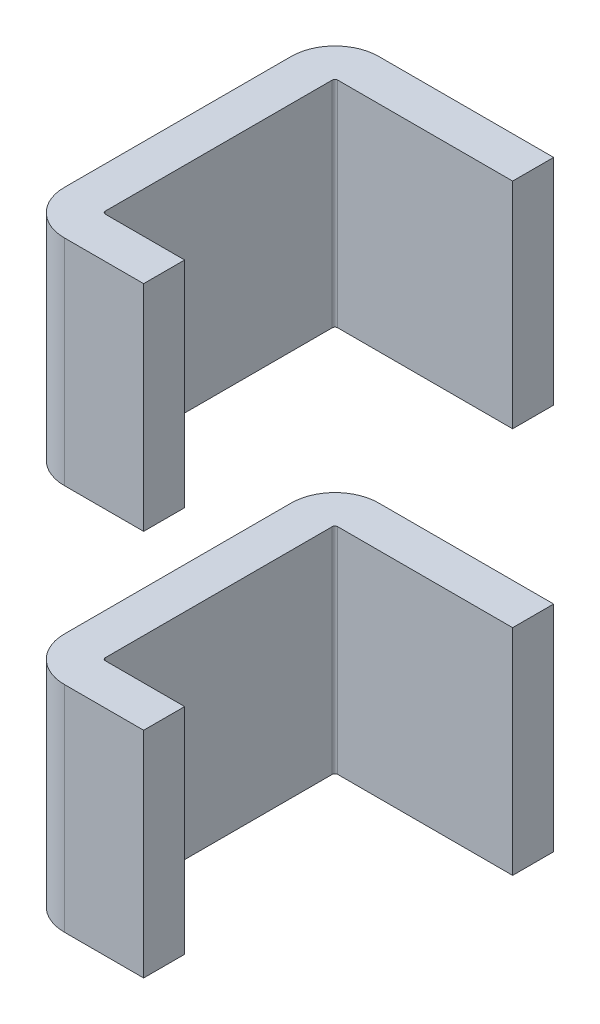
ISO-10303-21;
HEADER;
FILE_DESCRIPTION(('STEP AP214'),'2;1');
FILE_NAME('part.step','',(''),(''),'','','');
FILE_SCHEMA(('AUTOMOTIVE_DESIGN { 1 0 10303 214 1 1 1 1 }'));
ENDSEC;
DATA;
#1=APPLICATION_CONTEXT('core data for automotive mechanical design processes');
#2=APPLICATION_PROTOCOL_DEFINITION('international standard','automotive_design',2000,#1);
#3=PRODUCT_CONTEXT('',#1,'mechanical');
#4=PRODUCT('Part','Part','',(#3));
#5=PRODUCT_RELATED_PRODUCT_CATEGORY('part','',(#4));
#6=PRODUCT_DEFINITION_FORMATION('','',#4);
#7=PRODUCT_DEFINITION_CONTEXT('part definition',#1,'design');
#8=PRODUCT_DEFINITION('design','',#6,#7);
#9=PRODUCT_DEFINITION_SHAPE('','',#8);
#10=(LENGTH_UNIT() NAMED_UNIT(*) SI_UNIT(.MILLI.,.METRE.));
#11=(NAMED_UNIT(*) PLANE_ANGLE_UNIT() SI_UNIT($,.RADIAN.));
#12=(NAMED_UNIT(*) SI_UNIT($,.STERADIAN.) SOLID_ANGLE_UNIT());
#13=UNCERTAINTY_MEASURE_WITH_UNIT(LENGTH_MEASURE(1.E-05),#10,'distance_accuracy_value','');
#14=(GEOMETRIC_REPRESENTATION_CONTEXT(3) GLOBAL_UNCERTAINTY_ASSIGNED_CONTEXT((#13)) GLOBAL_UNIT_ASSIGNED_CONTEXT((#10,
#11,#12)) REPRESENTATION_CONTEXT('',''));
#15=CARTESIAN_POINT('',(0.,0.,0.));
#16=DIRECTION('',(0.,0.,1.));
#17=DIRECTION('',(1.,0.,0.));
#18=AXIS2_PLACEMENT_3D('',#15,#16,#17);
#19=CARTESIAN_POINT('',(-0.95,-1.1,-0.135));
#20=DIRECTION('',(0.,0.,-1.));
#21=DIRECTION('',(0.,1.,0.));
#22=AXIS2_PLACEMENT_3D('',#19,#20,#21);
#23=PLANE('',#22);
#24=DIRECTION('',(1.,0.,0.));
#25=VECTOR('',#24,1.);
#26=CARTESIAN_POINT('',(-0.95,1.1,-0.135));
#27=LINE('',#26,#25);
#28=CARTESIAN_POINT('',(-0.95,1.1,-0.135));
#29=VERTEX_POINT('',#28);
#30=CARTESIAN_POINT('',(-1.59,1.1,-0.135));
#31=VERTEX_POINT('',#30);
#32=EDGE_CURVE('P0_E181',#29,#31,#27,.F.);
#33=ORIENTED_EDGE('',*,*,#32,.F.);
#34=DIRECTION('',(0.,1.,0.));
#35=VECTOR('',#34,1.);
#36=CARTESIAN_POINT('',(-0.95,0.,-0.135));
#37=LINE('',#36,#35);
#38=CARTESIAN_POINT('',(-0.95,0.315,-0.135));
#39=VERTEX_POINT('',#38);
#40=EDGE_CURVE('P0_E124',#39,#29,#37,.T.);
#41=ORIENTED_EDGE('',*,*,#40,.F.);
#42=DIRECTION('',(1.,0.,0.));
#43=VECTOR('',#42,1.);
#44=CARTESIAN_POINT('',(-0.95,0.315,-0.135));
#45=LINE('',#44,#43);
#46=CARTESIAN_POINT('',(-1.59,0.315,-0.135));
#47=VERTEX_POINT('',#46);
#48=EDGE_CURVE('P0_E130',#39,#47,#45,.F.);
#49=ORIENTED_EDGE('',*,*,#48,.T.);
#50=DIRECTION('',(0.,1.,0.));
#51=VECTOR('',#50,1.);
#52=CARTESIAN_POINT('',(-1.59,0.,-0.135));
#53=LINE('',#52,#51);
#54=EDGE_CURVE('P0_E81',#31,#47,#53,.F.);
#55=ORIENTED_EDGE('',*,*,#54,.F.);
#56=EDGE_LOOP('',(#33,#41,#49,#55));
#57=FACE_BOUND('',#56,.T.);
#58=ADVANCED_FACE('P0_F17',(#57),#23,.T.);
#59=CARTESIAN_POINT('',(-1.59,0.,0.025));
#60=DIRECTION('',(0.,1.,0.));
#61=DIRECTION('',(0.,0.,1.));
#62=AXIS2_PLACEMENT_3D('',#59,#60,#61);
#63=CYLINDRICAL_SURFACE('',#62,0.16);
#64=CARTESIAN_POINT('',(-1.59,1.1,0.025));
#65=DIRECTION('',(0.,1.,0.));
#66=DIRECTION('',(0.,0.,1.));
#67=AXIS2_PLACEMENT_3D('',#64,#65,#66);
#68=CIRCLE('',#67,0.16);
#69=CARTESIAN_POINT('',(-1.75,1.1,0.025));
#70=VERTEX_POINT('',#69);
#71=EDGE_CURVE('P0_E179',#31,#70,#68,.T.);
#72=ORIENTED_EDGE('',*,*,#71,.F.);
#73=ORIENTED_EDGE('',*,*,#54,.T.);
#74=CARTESIAN_POINT('',(-1.59,0.315,0.025));
#75=DIRECTION('',(0.,1.,0.));
#76=DIRECTION('',(0.,0.,1.));
#77=AXIS2_PLACEMENT_3D('',#74,#75,#76);
#78=CIRCLE('',#77,0.16);
#79=CARTESIAN_POINT('',(-1.75,0.315,0.025));
#80=VERTEX_POINT('',#79);
#81=EDGE_CURVE('P0_E20',#47,#80,#78,.T.);
#82=ORIENTED_EDGE('',*,*,#81,.T.);
#83=DIRECTION('',(0.,-1.,0.));
#84=VECTOR('',#83,1.);
#85=CARTESIAN_POINT('',(-1.75,-1.1,0.025));
#86=LINE('',#85,#84);
#87=EDGE_CURVE('P0_E86',#70,#80,#86,.T.);
#88=ORIENTED_EDGE('',*,*,#87,.F.);
#89=EDGE_LOOP('',(#72,#73,#82,#88));
#90=FACE_BOUND('',#89,.T.);
#91=ADVANCED_FACE('P0_F85',(#90),#63,.T.);
#92=CARTESIAN_POINT('',(-1.75,-1.1,0.025));
#93=DIRECTION('',(-1.,0.,0.));
#94=DIRECTION('',(0.,-1.,0.));
#95=AXIS2_PLACEMENT_3D('',#92,#93,#94);
#96=PLANE('',#95);
#97=DIRECTION('',(0.,0.,1.));
#98=VECTOR('',#97,1.);
#99=CARTESIAN_POINT('',(-1.75,1.1,-0.135));
#100=LINE('',#99,#98);
#101=CARTESIAN_POINT('',(-1.75,1.1,0.855));
#102=VERTEX_POINT('',#101);
#103=EDGE_CURVE('P0_E97',#70,#102,#100,.T.);
#104=ORIENTED_EDGE('',*,*,#103,.F.);
#105=ORIENTED_EDGE('',*,*,#87,.T.);
#106=DIRECTION('',(0.,0.,1.));
#107=VECTOR('',#106,1.);
#108=CARTESIAN_POINT('',(-1.75,0.315,-1.593456681686));
#109=LINE('',#108,#107);
#110=CARTESIAN_POINT('',(-1.75,0.315,0.855));
#111=VERTEX_POINT('',#110);
#112=EDGE_CURVE('P0_E91',#80,#111,#109,.T.);
#113=ORIENTED_EDGE('',*,*,#112,.T.);
#114=DIRECTION('',(0.,1.,0.));
#115=VECTOR('',#114,1.);
#116=CARTESIAN_POINT('',(-1.75,0.,0.855));
#117=LINE('',#116,#115);
#118=EDGE_CURVE('P0_E99',#102,#111,#117,.F.);
#119=ORIENTED_EDGE('',*,*,#118,.F.);
#120=EDGE_LOOP('',(#104,#105,#113,#119));
#121=FACE_BOUND('',#120,.T.);
#122=ADVANCED_FACE('P0_F94',(#121),#96,.T.);
#123=CARTESIAN_POINT('',(-1.59,0.,0.855));
#124=DIRECTION('',(0.,1.,0.));
#125=DIRECTION('',(0.,0.,1.));
#126=AXIS2_PLACEMENT_3D('',#123,#124,#125);
#127=CYLINDRICAL_SURFACE('',#126,0.16);
#128=CARTESIAN_POINT('',(-1.59,1.1,0.855));
#129=DIRECTION('',(0.,1.,0.));
#130=DIRECTION('',(0.,0.,1.));
#131=AXIS2_PLACEMENT_3D('',#128,#129,#130);
#132=CIRCLE('',#131,0.16);
#133=CARTESIAN_POINT('',(-1.59,1.1,1.015));
#134=VERTEX_POINT('',#133);
#135=EDGE_CURVE('P0_E176',#102,#134,#132,.T.);
#136=ORIENTED_EDGE('',*,*,#135,.F.);
#137=ORIENTED_EDGE('',*,*,#118,.T.);
#138=CARTESIAN_POINT('',(-1.59,0.315,0.855));
#139=DIRECTION('',(0.,1.,0.));
#140=DIRECTION('',(0.,0.,1.));
#141=AXIS2_PLACEMENT_3D('',#138,#139,#140);
#142=CIRCLE('',#141,0.16);
#143=CARTESIAN_POINT('',(-1.59,0.315,1.015));
#144=VERTEX_POINT('',#143);
#145=EDGE_CURVE('P0_E105',#111,#144,#142,.T.);
#146=ORIENTED_EDGE('',*,*,#145,.T.);
#147=DIRECTION('',(0.,-1.,0.));
#148=VECTOR('',#147,1.);
#149=CARTESIAN_POINT('',(-1.59,-1.1,1.015));
#150=LINE('',#149,#148);
#151=EDGE_CURVE('P0_E145',#134,#144,#150,.T.);
#152=ORIENTED_EDGE('',*,*,#151,.F.);
#153=EDGE_LOOP('',(#136,#137,#146,#152));
#154=FACE_BOUND('',#153,.T.);
#155=ADVANCED_FACE('P0_F290',(#154),#127,.T.);
#156=CARTESIAN_POINT('',(-1.59,-1.1,1.015));
#157=DIRECTION('',(0.,0.,1.));
#158=DIRECTION('',(0.,-1.,0.));
#159=AXIS2_PLACEMENT_3D('',#156,#157,#158);
#160=PLANE('',#159);
#161=DIRECTION('',(1.,0.,0.));
#162=VECTOR('',#161,1.);
#163=CARTESIAN_POINT('',(-0.95,1.1,1.015));
#164=LINE('',#163,#162);
#165=CARTESIAN_POINT('',(-1.3,1.1,1.015));
#166=VERTEX_POINT('',#165);
#167=EDGE_CURVE('P0_E139',#134,#166,#164,.T.);
#168=ORIENTED_EDGE('',*,*,#167,.F.);
#169=ORIENTED_EDGE('',*,*,#151,.T.);
#170=DIRECTION('',(1.,0.,0.));
#171=VECTOR('',#170,1.);
#172=CARTESIAN_POINT('',(-0.95,0.315000000000001,1.015));
#173=LINE('',#172,#171);
#174=CARTESIAN_POINT('',(-1.3,0.315,1.015));
#175=VERTEX_POINT('',#174);
#176=EDGE_CURVE('P0_E107',#144,#175,#173,.T.);
#177=ORIENTED_EDGE('',*,*,#176,.T.);
#178=DIRECTION('',(0.,1.,0.));
#179=VECTOR('',#178,1.);
#180=CARTESIAN_POINT('',(-1.3,0.,1.015));
#181=LINE('',#180,#179);
#182=EDGE_CURVE('P0_E142',#175,#166,#181,.T.);
#183=ORIENTED_EDGE('',*,*,#182,.T.);
#184=EDGE_LOOP('',(#168,#169,#177,#183));
#185=FACE_BOUND('',#184,.T.);
#186=ADVANCED_FACE('P0_F215',(#185),#160,.T.);
#187=CARTESIAN_POINT('',(-1.3,0.,0.94));
#188=DIRECTION('',(-1.,0.,0.));
#189=DIRECTION('',(0.,0.,1.));
#190=AXIS2_PLACEMENT_3D('',#187,#188,#189);
#191=PLANE('',#190);
#192=DIRECTION('',(0.,0.,1.));
#193=VECTOR('',#192,1.);
#194=CARTESIAN_POINT('',(-1.3,0.315,-1.593456681686));
#195=LINE('',#194,#193);
#196=CARTESIAN_POINT('',(-1.3,0.315,0.865));
#197=VERTEX_POINT('',#196);
#198=EDGE_CURVE('P0_E162',#175,#197,#195,.F.);
#199=ORIENTED_EDGE('',*,*,#198,.T.);
#200=DIRECTION('',(0.,1.,0.));
#201=VECTOR('',#200,1.);
#202=CARTESIAN_POINT('',(-1.3,1.1,0.865));
#203=LINE('',#202,#201);
#204=CARTESIAN_POINT('',(-1.3,1.1,0.865));
#205=VERTEX_POINT('',#204);
#206=EDGE_CURVE('P0_E92',#205,#197,#203,.F.);
#207=ORIENTED_EDGE('',*,*,#206,.F.);
#208=DIRECTION('',(0.,0.,1.));
#209=VECTOR('',#208,1.);
#210=CARTESIAN_POINT('',(-1.3,1.1,-0.135));
#211=LINE('',#210,#209);
#212=EDGE_CURVE('P0_E135',#166,#205,#211,.F.);
#213=ORIENTED_EDGE('',*,*,#212,.F.);
#214=ORIENTED_EDGE('',*,*,#182,.F.);
#215=EDGE_LOOP('',(#199,#207,#213,#214));
#216=FACE_BOUND('',#215,.T.);
#217=ADVANCED_FACE('P0_F221',(#216),#191,.F.);
#218=CARTESIAN_POINT('',(-0.95,1.1,0.015));
#219=DIRECTION('',(0.,0.,1.));
#220=DIRECTION('',(0.,-1.,0.));
#221=AXIS2_PLACEMENT_3D('',#218,#219,#220);
#222=PLANE('',#221);
#223=DIRECTION('',(1.,0.,0.));
#224=VECTOR('',#223,1.);
#225=CARTESIAN_POINT('',(-0.95,1.1,0.015));
#226=LINE('',#225,#224);
#227=CARTESIAN_POINT('',(-1.59,1.1,0.015));
#228=VERTEX_POINT('',#227);
#229=CARTESIAN_POINT('',(-0.95,1.1,0.015));
#230=VERTEX_POINT('',#229);
#231=EDGE_CURVE('P0_E118',#228,#230,#226,.T.);
#232=ORIENTED_EDGE('',*,*,#231,.F.);
#233=DIRECTION('',(0.,1.,0.));
#234=VECTOR('',#233,1.);
#235=CARTESIAN_POINT('',(-1.59,0.,0.015));
#236=LINE('',#235,#234);
#237=CARTESIAN_POINT('',(-1.59,0.315,0.015));
#238=VERTEX_POINT('',#237);
#239=EDGE_CURVE('P0_E127',#228,#238,#236,.F.);
#240=ORIENTED_EDGE('',*,*,#239,.T.);
#241=DIRECTION('',(1.,0.,0.));
#242=VECTOR('',#241,1.);
#243=CARTESIAN_POINT('',(-0.95,0.315,0.015));
#244=LINE('',#243,#242);
#245=CARTESIAN_POINT('',(-0.95,0.315,0.015));
#246=VERTEX_POINT('',#245);
#247=EDGE_CURVE('P0_E159',#238,#246,#244,.T.);
#248=ORIENTED_EDGE('',*,*,#247,.T.);
#249=DIRECTION('',(0.,1.,0.));
#250=VECTOR('',#249,1.);
#251=CARTESIAN_POINT('',(-0.95,0.,0.015));
#252=LINE('',#251,#250);
#253=EDGE_CURVE('P0_E121',#230,#246,#252,.F.);
#254=ORIENTED_EDGE('',*,*,#253,.F.);
#255=EDGE_LOOP('',(#232,#240,#248,#254));
#256=FACE_BOUND('',#255,.T.);
#257=ADVANCED_FACE('P0_F256',(#256),#222,.T.);
#258=CARTESIAN_POINT('',(-0.95,0.,-0.06));
#259=DIRECTION('',(1.,0.,0.));
#260=DIRECTION('',(0.,0.,-1.));
#261=AXIS2_PLACEMENT_3D('',#258,#259,#260);
#262=PLANE('',#261);
#263=DIRECTION('',(0.,0.,1.));
#264=VECTOR('',#263,1.);
#265=CARTESIAN_POINT('',(-0.95,1.1,-0.135));
#266=LINE('',#265,#264);
#267=EDGE_CURVE('P0_E115',#230,#29,#266,.F.);
#268=ORIENTED_EDGE('',*,*,#267,.F.);
#269=ORIENTED_EDGE('',*,*,#253,.T.);
#270=DIRECTION('',(0.,0.,1.));
#271=VECTOR('',#270,1.);
#272=CARTESIAN_POINT('',(-0.95,0.315,-1.593456681686));
#273=LINE('',#272,#271);
#274=EDGE_CURVE('P0_E156',#246,#39,#273,.F.);
#275=ORIENTED_EDGE('',*,*,#274,.T.);
#276=ORIENTED_EDGE('',*,*,#40,.T.);
#277=EDGE_LOOP('',(#268,#269,#275,#276));
#278=FACE_BOUND('',#277,.T.);
#279=ADVANCED_FACE('P0_F258',(#278),#262,.T.);
#280=CARTESIAN_POINT('',(-1.59,1.1,0.865));
#281=DIRECTION('',(0.,0.,-1.));
#282=DIRECTION('',(0.,1.,0.));
#283=AXIS2_PLACEMENT_3D('',#280,#281,#282);
#284=PLANE('',#283);
#285=DIRECTION('',(1.,0.,0.));
#286=VECTOR('',#285,1.);
#287=CARTESIAN_POINT('',(-0.95,1.1,0.865));
#288=LINE('',#287,#286);
#289=CARTESIAN_POINT('',(-1.59,1.1,0.865));
#290=VERTEX_POINT('',#289);
#291=EDGE_CURVE('P0_E138',#205,#290,#288,.F.);
#292=ORIENTED_EDGE('',*,*,#291,.F.);
#293=ORIENTED_EDGE('',*,*,#206,.T.);
#294=DIRECTION('',(1.,0.,0.));
#295=VECTOR('',#294,1.);
#296=CARTESIAN_POINT('',(-0.95,0.315000000000001,0.865));
#297=LINE('',#296,#295);
#298=CARTESIAN_POINT('',(-1.59,0.315,0.865));
#299=VERTEX_POINT('',#298);
#300=EDGE_CURVE('P0_E165',#197,#299,#297,.F.);
#301=ORIENTED_EDGE('',*,*,#300,.T.);
#302=DIRECTION('',(0.,1.,0.));
#303=VECTOR('',#302,1.);
#304=CARTESIAN_POINT('',(-1.59,0.,0.865));
#305=LINE('',#304,#303);
#306=EDGE_CURVE('P0_E112',#299,#290,#305,.T.);
#307=ORIENTED_EDGE('',*,*,#306,.T.);
#308=EDGE_LOOP('',(#292,#293,#301,#307));
#309=FACE_BOUND('',#308,.T.);
#310=ADVANCED_FACE('P0_F232',(#309),#284,.T.);
#311=CARTESIAN_POINT('',(-0.95,0.315,-1.593456681686));
#312=DIRECTION('',(0.,1.,0.));
#313=DIRECTION('',(0.,0.,1.));
#314=AXIS2_PLACEMENT_3D('',#311,#312,#313);
#315=PLANE('',#314);
#316=ORIENTED_EDGE('',*,*,#274,.F.);
#317=ORIENTED_EDGE('',*,*,#247,.F.);
#318=CARTESIAN_POINT('',(-1.59,0.315,0.025));
#319=DIRECTION('',(0.,1.,0.));
#320=DIRECTION('',(0.,0.,1.));
#321=AXIS2_PLACEMENT_3D('',#318,#319,#320);
#322=CIRCLE('',#321,0.01);
#323=CARTESIAN_POINT('',(-1.6,0.315,0.025));
#324=VERTEX_POINT('',#323);
#325=EDGE_CURVE('P0_E129',#238,#324,#322,.T.);
#326=ORIENTED_EDGE('',*,*,#325,.T.);
#327=DIRECTION('',(0.,0.,1.));
#328=VECTOR('',#327,1.);
#329=CARTESIAN_POINT('',(-1.6,0.315,0.025));
#330=LINE('',#329,#328);
#331=CARTESIAN_POINT('',(-1.6,0.315,0.855));
#332=VERTEX_POINT('',#331);
#333=EDGE_CURVE('P0_E171',#332,#324,#330,.F.);
#334=ORIENTED_EDGE('',*,*,#333,.F.);
#335=CARTESIAN_POINT('',(-1.59,0.315,0.855));
#336=DIRECTION('',(0.,1.,0.));
#337=DIRECTION('',(0.,0.,1.));
#338=AXIS2_PLACEMENT_3D('',#335,#336,#337);
#339=CIRCLE('',#338,0.01);
#340=EDGE_CURVE('P0_E168',#332,#299,#339,.T.);
#341=ORIENTED_EDGE('',*,*,#340,.T.);
#342=ORIENTED_EDGE('',*,*,#300,.F.);
#343=ORIENTED_EDGE('',*,*,#198,.F.);
#344=ORIENTED_EDGE('',*,*,#176,.F.);
#345=ORIENTED_EDGE('',*,*,#145,.F.);
#346=ORIENTED_EDGE('',*,*,#112,.F.);
#347=ORIENTED_EDGE('',*,*,#81,.F.);
#348=ORIENTED_EDGE('',*,*,#48,.F.);
#349=EDGE_LOOP('',(#316,#317,#326,#334,#341,#342,#343,#344,#345,#346,#347,#348));
#350=FACE_BOUND('',#349,.T.);
#351=ADVANCED_FACE('P0_F103',(#350),#315,.F.);
#352=CARTESIAN_POINT('',(-1.59,0.,0.025));
#353=DIRECTION('',(0.,1.,0.));
#354=DIRECTION('',(0.,0.,1.));
#355=AXIS2_PLACEMENT_3D('',#352,#353,#354);
#356=CYLINDRICAL_SURFACE('',#355,0.01);
#357=ORIENTED_EDGE('',*,*,#239,.F.);
#358=CARTESIAN_POINT('',(-1.59,1.1,0.025));
#359=DIRECTION('',(0.,1.,0.));
#360=DIRECTION('',(0.,0.,1.));
#361=AXIS2_PLACEMENT_3D('',#358,#359,#360);
#362=CIRCLE('',#361,0.01);
#363=CARTESIAN_POINT('',(-1.6,1.1,0.025));
#364=VERTEX_POINT('',#363);
#365=EDGE_CURVE('P0_E173',#364,#228,#362,.F.);
#366=ORIENTED_EDGE('',*,*,#365,.F.);
#367=DIRECTION('',(0.,1.,0.));
#368=VECTOR('',#367,1.);
#369=CARTESIAN_POINT('',(-1.6,1.1,0.025));
#370=LINE('',#369,#368);
#371=EDGE_CURVE('P0_E194',#324,#364,#370,.T.);
#372=ORIENTED_EDGE('',*,*,#371,.F.);
#373=ORIENTED_EDGE('',*,*,#325,.F.);
#374=EDGE_LOOP('',(#357,#366,#372,#373));
#375=FACE_BOUND('',#374,.T.);
#376=ADVANCED_FACE('P0_F261',(#375),#356,.F.);
#377=CARTESIAN_POINT('',(-0.95,1.1,-0.135));
#378=DIRECTION('',(0.,1.,0.));
#379=DIRECTION('',(0.,0.,1.));
#380=AXIS2_PLACEMENT_3D('',#377,#378,#379);
#381=PLANE('',#380);
#382=ORIENTED_EDGE('',*,*,#231,.T.);
#383=ORIENTED_EDGE('',*,*,#267,.T.);
#384=ORIENTED_EDGE('',*,*,#32,.T.);
#385=ORIENTED_EDGE('',*,*,#71,.T.);
#386=ORIENTED_EDGE('',*,*,#103,.T.);
#387=ORIENTED_EDGE('',*,*,#135,.T.);
#388=ORIENTED_EDGE('',*,*,#167,.T.);
#389=ORIENTED_EDGE('',*,*,#212,.T.);
#390=ORIENTED_EDGE('',*,*,#291,.T.);
#391=CARTESIAN_POINT('',(-1.59,1.1,0.855));
#392=DIRECTION('',(0.,1.,0.));
#393=DIRECTION('',(0.,0.,1.));
#394=AXIS2_PLACEMENT_3D('',#391,#392,#393);
#395=CIRCLE('',#394,0.01);
#396=CARTESIAN_POINT('',(-1.6,1.1,0.855));
#397=VERTEX_POINT('',#396);
#398=EDGE_CURVE('P0_E35',#290,#397,#395,.F.);
#399=ORIENTED_EDGE('',*,*,#398,.T.);
#400=DIRECTION('',(0.,0.,1.));
#401=VECTOR('',#400,1.);
#402=CARTESIAN_POINT('',(-1.6,1.1,0.025));
#403=LINE('',#402,#401);
#404=EDGE_CURVE('P0_E26',#364,#397,#403,.T.);
#405=ORIENTED_EDGE('',*,*,#404,.F.);
#406=ORIENTED_EDGE('',*,*,#365,.T.);
#407=EDGE_LOOP('',(#382,#383,#384,#385,#386,#387,#388,#389,#390,#399,#405,#406));
#408=FACE_BOUND('',#407,.T.);
#409=ADVANCED_FACE('P0_F244',(#408),#381,.T.);
#410=CARTESIAN_POINT('',(-1.59,0.,0.855));
#411=DIRECTION('',(0.,1.,0.));
#412=DIRECTION('',(0.,0.,1.));
#413=AXIS2_PLACEMENT_3D('',#410,#411,#412);
#414=CYLINDRICAL_SURFACE('',#413,0.01);
#415=DIRECTION('',(0.,1.,0.));
#416=VECTOR('',#415,1.);
#417=CARTESIAN_POINT('',(-1.6,1.1,0.855));
#418=LINE('',#417,#416);
#419=EDGE_CURVE('P0_E11',#397,#332,#418,.F.);
#420=ORIENTED_EDGE('',*,*,#419,.F.);
#421=ORIENTED_EDGE('',*,*,#398,.F.);
#422=ORIENTED_EDGE('',*,*,#306,.F.);
#423=ORIENTED_EDGE('',*,*,#340,.F.);
#424=EDGE_LOOP('',(#420,#421,#422,#423));
#425=FACE_BOUND('',#424,.T.);
#426=ADVANCED_FACE('P0_F265',(#425),#414,.F.);
#427=CARTESIAN_POINT('',(-1.6,1.1,0.025));
#428=DIRECTION('',(1.,0.,0.));
#429=DIRECTION('',(0.,1.,0.));
#430=AXIS2_PLACEMENT_3D('',#427,#428,#429);
#431=PLANE('',#430);
#432=ORIENTED_EDGE('',*,*,#404,.T.);
#433=ORIENTED_EDGE('',*,*,#419,.T.);
#434=ORIENTED_EDGE('',*,*,#333,.T.);
#435=ORIENTED_EDGE('',*,*,#371,.T.);
#436=EDGE_LOOP('',(#432,#433,#434,#435));
#437=FACE_BOUND('',#436,.T.);
#438=ADVANCED_FACE('P0_F263',(#437),#431,.T.);
#439=CLOSED_SHELL('',(#58,#91,#122,#155,#186,#217,#257,#279,#310,#351,#376,#409,#426,#438));
#440=MANIFOLD_SOLID_BREP('P0_B1',#439);
#441=CARTESIAN_POINT('',(-0.95,1.1,0.015));
#442=DIRECTION('',(0.,0.,1.));
#443=DIRECTION('',(0.,-1.,0.));
#444=AXIS2_PLACEMENT_3D('',#441,#442,#443);
#445=PLANE('',#444);
#446=DIRECTION('',(1.,0.,0.));
#447=VECTOR('',#446,1.);
#448=CARTESIAN_POINT('',(-0.95,-1.1,0.015));
#449=LINE('',#448,#447);
#450=CARTESIAN_POINT('',(-0.95,-1.1,0.015));
#451=VERTEX_POINT('',#450);
#452=CARTESIAN_POINT('',(-1.59,-1.1,0.015));
#453=VERTEX_POINT('',#452);
#454=EDGE_CURVE('P1_E159',#451,#453,#449,.F.);
#455=ORIENTED_EDGE('',*,*,#454,.F.);
#456=DIRECTION('',(0.,1.,0.));
#457=VECTOR('',#456,1.);
#458=CARTESIAN_POINT('',(-0.95,0.,0.015));
#459=LINE('',#458,#457);
#460=CARTESIAN_POINT('',(-0.95,-0.315,0.015));
#461=VERTEX_POINT('',#460);
#462=EDGE_CURVE('P1_E95',#461,#451,#459,.F.);
#463=ORIENTED_EDGE('',*,*,#462,.F.);
#464=DIRECTION('',(1.,0.,0.));
#465=VECTOR('',#464,1.);
#466=CARTESIAN_POINT('',(-1.75,-0.315,0.015));
#467=LINE('',#466,#465);
#468=CARTESIAN_POINT('',(-1.59,-0.315,0.015));
#469=VERTEX_POINT('',#468);
#470=EDGE_CURVE('P1_E88',#461,#469,#467,.F.);
#471=ORIENTED_EDGE('',*,*,#470,.T.);
#472=DIRECTION('',(0.,1.,0.));
#473=VECTOR('',#472,1.);
#474=CARTESIAN_POINT('',(-1.59,0.,0.015));
#475=LINE('',#474,#473);
#476=EDGE_CURVE('P1_E218',#469,#453,#475,.F.);
#477=ORIENTED_EDGE('',*,*,#476,.T.);
#478=EDGE_LOOP('',(#455,#463,#471,#477));
#479=FACE_BOUND('',#478,.T.);
#480=ADVANCED_FACE('P1_F17',(#479),#445,.T.);
#481=CARTESIAN_POINT('',(-1.59,0.,0.025));
#482=DIRECTION('',(0.,1.,0.));
#483=DIRECTION('',(0.,0.,1.));
#484=AXIS2_PLACEMENT_3D('',#481,#482,#483);
#485=CYLINDRICAL_SURFACE('',#484,0.01);
#486=DIRECTION('',(0.,1.,0.));
#487=VECTOR('',#486,1.);
#488=CARTESIAN_POINT('',(-1.6,1.1,0.025));
#489=LINE('',#488,#487);
#490=CARTESIAN_POINT('',(-1.6,-1.1,0.025));
#491=VERTEX_POINT('',#490);
#492=CARTESIAN_POINT('',(-1.6,-0.315,0.025));
#493=VERTEX_POINT('',#492);
#494=EDGE_CURVE('P1_E215',#491,#493,#489,.T.);
#495=ORIENTED_EDGE('',*,*,#494,.F.);
#496=CARTESIAN_POINT('',(-1.59,-1.1,0.025));
#497=DIRECTION('',(0.,1.,0.));
#498=DIRECTION('',(0.,0.,1.));
#499=AXIS2_PLACEMENT_3D('',#496,#497,#498);
#500=CIRCLE('',#499,0.01);
#501=EDGE_CURVE('P1_E158',#453,#491,#500,.T.);
#502=ORIENTED_EDGE('',*,*,#501,.F.);
#503=ORIENTED_EDGE('',*,*,#476,.F.);
#504=CARTESIAN_POINT('',(-1.59,-0.315,0.025));
#505=DIRECTION('',(0.,1.,0.));
#506=DIRECTION('',(0.,0.,1.));
#507=AXIS2_PLACEMENT_3D('',#504,#505,#506);
#508=CIRCLE('',#507,0.01);
#509=EDGE_CURVE('P1_E20',#469,#493,#508,.T.);
#510=ORIENTED_EDGE('',*,*,#509,.T.);
#511=EDGE_LOOP('',(#495,#502,#503,#510));
#512=FACE_BOUND('',#511,.T.);
#513=ADVANCED_FACE('P1_F260',(#512),#485,.F.);
#514=CARTESIAN_POINT('',(-1.6,1.1,0.025));
#515=DIRECTION('',(1.,0.,0.));
#516=DIRECTION('',(0.,1.,0.));
#517=AXIS2_PLACEMENT_3D('',#514,#515,#516);
#518=PLANE('',#517);
#519=DIRECTION('',(0.,0.,-1.));
#520=VECTOR('',#519,1.);
#521=CARTESIAN_POINT('',(-1.6,-1.1,0.015));
#522=LINE('',#521,#520);
#523=CARTESIAN_POINT('',(-1.6,-1.1,0.855));
#524=VERTEX_POINT('',#523);
#525=EDGE_CURVE('P1_E155',#491,#524,#522,.F.);
#526=ORIENTED_EDGE('',*,*,#525,.F.);
#527=ORIENTED_EDGE('',*,*,#494,.T.);
#528=DIRECTION('',(0.,0.,-1.));
#529=VECTOR('',#528,1.);
#530=CARTESIAN_POINT('',(-1.6,-0.315,-1.593456681686));
#531=LINE('',#530,#529);
#532=CARTESIAN_POINT('',(-1.6,-0.315,0.855));
#533=VERTEX_POINT('',#532);
#534=EDGE_CURVE('P1_E187',#493,#533,#531,.F.);
#535=ORIENTED_EDGE('',*,*,#534,.T.);
#536=DIRECTION('',(0.,1.,0.));
#537=VECTOR('',#536,1.);
#538=CARTESIAN_POINT('',(-1.6,0.,0.855));
#539=LINE('',#538,#537);
#540=EDGE_CURVE('P1_E213',#533,#524,#539,.F.);
#541=ORIENTED_EDGE('',*,*,#540,.T.);
#542=EDGE_LOOP('',(#526,#527,#535,#541));
#543=FACE_BOUND('',#542,.T.);
#544=ADVANCED_FACE('P1_F257',(#543),#518,.T.);
#545=CARTESIAN_POINT('',(-1.59,0.,0.855));
#546=DIRECTION('',(0.,1.,0.));
#547=DIRECTION('',(0.,0.,1.));
#548=AXIS2_PLACEMENT_3D('',#545,#546,#547);
#549=CYLINDRICAL_SURFACE('',#548,0.01);
#550=DIRECTION('',(0.,1.,0.));
#551=VECTOR('',#550,1.);
#552=CARTESIAN_POINT('',(-1.59,1.1,0.865));
#553=LINE('',#552,#551);
#554=CARTESIAN_POINT('',(-1.59,-1.1,0.865));
#555=VERTEX_POINT('',#554);
#556=CARTESIAN_POINT('',(-1.59,-0.315,0.865));
#557=VERTEX_POINT('',#556);
#558=EDGE_CURVE('P1_E208',#555,#557,#553,.T.);
#559=ORIENTED_EDGE('',*,*,#558,.F.);
#560=CARTESIAN_POINT('',(-1.59,-1.1,0.855));
#561=DIRECTION('',(0.,1.,0.));
#562=DIRECTION('',(0.,0.,1.));
#563=AXIS2_PLACEMENT_3D('',#560,#561,#562);
#564=CIRCLE('',#563,0.01);
#565=EDGE_CURVE('P1_E152',#524,#555,#564,.T.);
#566=ORIENTED_EDGE('',*,*,#565,.F.);
#567=ORIENTED_EDGE('',*,*,#540,.F.);
#568=CARTESIAN_POINT('',(-1.59,-0.315,0.855));
#569=DIRECTION('',(0.,1.,0.));
#570=DIRECTION('',(0.,0.,1.));
#571=AXIS2_PLACEMENT_3D('',#568,#569,#570);
#572=CIRCLE('',#571,0.01);
#573=EDGE_CURVE('P1_E184',#533,#557,#572,.T.);
#574=ORIENTED_EDGE('',*,*,#573,.T.);
#575=EDGE_LOOP('',(#559,#566,#567,#574));
#576=FACE_BOUND('',#575,.T.);
#577=ADVANCED_FACE('P1_F240',(#576),#549,.F.);
#578=CARTESIAN_POINT('',(-1.59,1.1,0.865));
#579=DIRECTION('',(0.,0.,-1.));
#580=DIRECTION('',(0.,1.,0.));
#581=AXIS2_PLACEMENT_3D('',#578,#579,#580);
#582=PLANE('',#581);
#583=DIRECTION('',(1.,0.,0.));
#584=VECTOR('',#583,1.);
#585=CARTESIAN_POINT('',(-0.95,-1.1,0.865));
#586=LINE('',#585,#584);
#587=CARTESIAN_POINT('',(-1.3,-1.1,0.865));
#588=VERTEX_POINT('',#587);
#589=EDGE_CURVE('P1_E149',#555,#588,#586,.T.);
#590=ORIENTED_EDGE('',*,*,#589,.F.);
#591=ORIENTED_EDGE('',*,*,#558,.T.);
#592=DIRECTION('',(1.,0.,0.));
#593=VECTOR('',#592,1.);
#594=CARTESIAN_POINT('',(-1.75,-0.315,0.865));
#595=LINE('',#594,#593);
#596=CARTESIAN_POINT('',(-1.3,-0.315,0.865));
#597=VERTEX_POINT('',#596);
#598=EDGE_CURVE('P1_E182',#557,#597,#595,.T.);
#599=ORIENTED_EDGE('',*,*,#598,.T.);
#600=DIRECTION('',(0.,1.,0.));
#601=VECTOR('',#600,1.);
#602=CARTESIAN_POINT('',(-1.3,0.,0.865));
#603=LINE('',#602,#601);
#604=EDGE_CURVE('P1_E106',#597,#588,#603,.F.);
#605=ORIENTED_EDGE('',*,*,#604,.T.);
#606=EDGE_LOOP('',(#590,#591,#599,#605));
#607=FACE_BOUND('',#606,.T.);
#608=ADVANCED_FACE('P1_F245',(#607),#582,.T.);
#609=CARTESIAN_POINT('',(-1.3,0.,0.94));
#610=DIRECTION('',(-1.,0.,0.));
#611=DIRECTION('',(0.,0.,1.));
#612=AXIS2_PLACEMENT_3D('',#609,#610,#611);
#613=PLANE('',#612);
#614=DIRECTION('',(0.,0.,-1.));
#615=VECTOR('',#614,1.);
#616=CARTESIAN_POINT('',(-1.3,-0.315,-1.593456681686));
#617=LINE('',#616,#615);
#618=CARTESIAN_POINT('',(-1.3,-0.315,1.015));
#619=VERTEX_POINT('',#618);
#620=EDGE_CURVE('P1_E179',#597,#619,#617,.F.);
#621=ORIENTED_EDGE('',*,*,#620,.T.);
#622=DIRECTION('',(0.,-1.,0.));
#623=VECTOR('',#622,1.);
#624=CARTESIAN_POINT('',(-1.3,-1.1,1.015));
#625=LINE('',#624,#623);
#626=CARTESIAN_POINT('',(-1.3,-1.1,1.015));
#627=VERTEX_POINT('',#626);
#628=EDGE_CURVE('P1_E113',#627,#619,#625,.F.);
#629=ORIENTED_EDGE('',*,*,#628,.F.);
#630=DIRECTION('',(0.,0.,-1.));
#631=VECTOR('',#630,1.);
#632=CARTESIAN_POINT('',(-1.3,-1.1,0.015));
#633=LINE('',#632,#631);
#634=EDGE_CURVE('P1_E146',#588,#627,#633,.F.);
#635=ORIENTED_EDGE('',*,*,#634,.F.);
#636=ORIENTED_EDGE('',*,*,#604,.F.);
#637=EDGE_LOOP('',(#621,#629,#635,#636));
#638=FACE_BOUND('',#637,.T.);
#639=ADVANCED_FACE('P1_F250',(#638),#613,.F.);
#640=CARTESIAN_POINT('',(-0.95,-1.1,-0.135));
#641=DIRECTION('',(0.,0.,-1.));
#642=DIRECTION('',(0.,1.,0.));
#643=AXIS2_PLACEMENT_3D('',#640,#641,#642);
#644=PLANE('',#643);
#645=DIRECTION('',(1.,0.,0.));
#646=VECTOR('',#645,1.);
#647=CARTESIAN_POINT('',(-0.95,-1.1,-0.135));
#648=LINE('',#647,#646);
#649=CARTESIAN_POINT('',(-1.59,-1.1,-0.135));
#650=VERTEX_POINT('',#649);
#651=CARTESIAN_POINT('',(-0.95,-1.1,-0.135));
#652=VERTEX_POINT('',#651);
#653=EDGE_CURVE('P1_E125',#650,#652,#648,.T.);
#654=ORIENTED_EDGE('',*,*,#653,.F.);
#655=DIRECTION('',(0.,1.,0.));
#656=VECTOR('',#655,1.);
#657=CARTESIAN_POINT('',(-1.59,0.,-0.135));
#658=LINE('',#657,#656);
#659=CARTESIAN_POINT('',(-1.59,-0.315,-0.135));
#660=VERTEX_POINT('',#659);
#661=EDGE_CURVE('P1_E161',#660,#650,#658,.F.);
#662=ORIENTED_EDGE('',*,*,#661,.F.);
#663=DIRECTION('',(1.,0.,0.));
#664=VECTOR('',#663,1.);
#665=CARTESIAN_POINT('',(-1.75,-0.315,-0.135));
#666=LINE('',#665,#664);
#667=CARTESIAN_POINT('',(-0.95,-0.315,-0.135));
#668=VERTEX_POINT('',#667);
#669=EDGE_CURVE('P1_E127',#660,#668,#666,.T.);
#670=ORIENTED_EDGE('',*,*,#669,.T.);
#671=DIRECTION('',(0.,1.,0.));
#672=VECTOR('',#671,1.);
#673=CARTESIAN_POINT('',(-0.95,0.,-0.135));
#674=LINE('',#673,#672);
#675=EDGE_CURVE('P1_E120',#652,#668,#674,.T.);
#676=ORIENTED_EDGE('',*,*,#675,.F.);
#677=EDGE_LOOP('',(#654,#662,#670,#676));
#678=FACE_BOUND('',#677,.T.);
#679=ADVANCED_FACE('P1_F122',(#678),#644,.T.);
#680=CARTESIAN_POINT('',(-0.95,0.,-0.06));
#681=DIRECTION('',(1.,0.,0.));
#682=DIRECTION('',(0.,0.,-1.));
#683=AXIS2_PLACEMENT_3D('',#680,#681,#682);
#684=PLANE('',#683);
#685=DIRECTION('',(0.,0.,-1.));
#686=VECTOR('',#685,1.);
#687=CARTESIAN_POINT('',(-0.95,-1.1,0.015));
#688=LINE('',#687,#686);
#689=EDGE_CURVE('P1_E132',#652,#451,#688,.F.);
#690=ORIENTED_EDGE('',*,*,#689,.F.);
#691=ORIENTED_EDGE('',*,*,#675,.T.);
#692=DIRECTION('',(0.,0.,-1.));
#693=VECTOR('',#692,1.);
#694=CARTESIAN_POINT('',(-0.95,-0.315,-1.593456681686));
#695=LINE('',#694,#693);
#696=EDGE_CURVE('P1_E190',#668,#461,#695,.F.);
#697=ORIENTED_EDGE('',*,*,#696,.T.);
#698=ORIENTED_EDGE('',*,*,#462,.T.);
#699=EDGE_LOOP('',(#690,#691,#697,#698));
#700=FACE_BOUND('',#699,.T.);
#701=ADVANCED_FACE('P1_F133',(#700),#684,.T.);
#702=CARTESIAN_POINT('',(-1.59,-1.1,1.015));
#703=DIRECTION('',(0.,0.,1.));
#704=DIRECTION('',(0.,-1.,0.));
#705=AXIS2_PLACEMENT_3D('',#702,#703,#704);
#706=PLANE('',#705);
#707=DIRECTION('',(1.,0.,0.));
#708=VECTOR('',#707,1.);
#709=CARTESIAN_POINT('',(-0.95,-1.1,1.015));
#710=LINE('',#709,#708);
#711=CARTESIAN_POINT('',(-1.59,-1.1,1.015));
#712=VERTEX_POINT('',#711);
#713=EDGE_CURVE('P1_E140',#627,#712,#710,.F.);
#714=ORIENTED_EDGE('',*,*,#713,.F.);
#715=ORIENTED_EDGE('',*,*,#628,.T.);
#716=DIRECTION('',(1.,0.,0.));
#717=VECTOR('',#716,1.);
#718=CARTESIAN_POINT('',(-1.75,-0.315,1.015));
#719=LINE('',#718,#717);
#720=CARTESIAN_POINT('',(-1.59,-0.315,1.015));
#721=VERTEX_POINT('',#720);
#722=EDGE_CURVE('P1_E175',#619,#721,#719,.F.);
#723=ORIENTED_EDGE('',*,*,#722,.T.);
#724=DIRECTION('',(0.,1.,0.));
#725=VECTOR('',#724,1.);
#726=CARTESIAN_POINT('',(-1.59,0.,1.015));
#727=LINE('',#726,#725);
#728=EDGE_CURVE('P1_E172',#712,#721,#727,.T.);
#729=ORIENTED_EDGE('',*,*,#728,.F.);
#730=EDGE_LOOP('',(#714,#715,#723,#729));
#731=FACE_BOUND('',#730,.T.);
#732=ADVANCED_FACE('P1_F252',(#731),#706,.T.);
#733=CARTESIAN_POINT('',(-1.75,-0.315,-1.593456681686));
#734=DIRECTION('',(0.,-1.,0.));
#735=DIRECTION('',(0.,0.,-1.));
#736=AXIS2_PLACEMENT_3D('',#733,#734,#735);
#737=PLANE('',#736);
#738=CARTESIAN_POINT('',(-1.59,-0.315,0.025));
#739=DIRECTION('',(0.,1.,0.));
#740=DIRECTION('',(0.,0.,1.));
#741=AXIS2_PLACEMENT_3D('',#738,#739,#740);
#742=CIRCLE('',#741,0.16);
#743=CARTESIAN_POINT('',(-1.75,-0.315,0.025));
#744=VERTEX_POINT('',#743);
#745=EDGE_CURVE('P1_E174',#744,#660,#742,.F.);
#746=ORIENTED_EDGE('',*,*,#745,.F.);
#747=DIRECTION('',(0.,0.,1.));
#748=VECTOR('',#747,1.);
#749=CARTESIAN_POINT('',(-1.75,-0.315,0.025));
#750=LINE('',#749,#748);
#751=CARTESIAN_POINT('',(-1.75,-0.315,0.855));
#752=VERTEX_POINT('',#751);
#753=EDGE_CURVE('P1_E167',#752,#744,#750,.F.);
#754=ORIENTED_EDGE('',*,*,#753,.F.);
#755=CARTESIAN_POINT('',(-1.59,-0.315,0.855));
#756=DIRECTION('',(0.,1.,0.));
#757=DIRECTION('',(0.,0.,1.));
#758=AXIS2_PLACEMENT_3D('',#755,#756,#757);
#759=CIRCLE('',#758,0.16);
#760=EDGE_CURVE('P1_E135',#721,#752,#759,.F.);
#761=ORIENTED_EDGE('',*,*,#760,.F.);
#762=ORIENTED_EDGE('',*,*,#722,.F.);
#763=ORIENTED_EDGE('',*,*,#620,.F.);
#764=ORIENTED_EDGE('',*,*,#598,.F.);
#765=ORIENTED_EDGE('',*,*,#573,.F.);
#766=ORIENTED_EDGE('',*,*,#534,.F.);
#767=ORIENTED_EDGE('',*,*,#509,.F.);
#768=ORIENTED_EDGE('',*,*,#470,.F.);
#769=ORIENTED_EDGE('',*,*,#696,.F.);
#770=ORIENTED_EDGE('',*,*,#669,.F.);
#771=EDGE_LOOP('',(#746,#754,#761,#762,#763,#764,#765,#766,#767,#768,#769,#770));
#772=FACE_BOUND('',#771,.T.);
#773=ADVANCED_FACE('P1_F247',(#772),#737,.F.);
#774=CARTESIAN_POINT('',(-1.59,0.,0.025));
#775=DIRECTION('',(0.,1.,0.));
#776=DIRECTION('',(0.,0.,1.));
#777=AXIS2_PLACEMENT_3D('',#774,#775,#776);
#778=CYLINDRICAL_SURFACE('',#777,0.16);
#779=CARTESIAN_POINT('',(-1.59,-1.1,0.025));
#780=DIRECTION('',(0.,1.,0.));
#781=DIRECTION('',(0.,0.,1.));
#782=AXIS2_PLACEMENT_3D('',#779,#780,#781);
#783=CIRCLE('',#782,0.16);
#784=CARTESIAN_POINT('',(-1.75,-1.1,0.025));
#785=VERTEX_POINT('',#784);
#786=EDGE_CURVE('P1_E138',#785,#650,#783,.F.);
#787=ORIENTED_EDGE('',*,*,#786,.F.);
#788=DIRECTION('',(0.,-1.,0.));
#789=VECTOR('',#788,1.);
#790=CARTESIAN_POINT('',(-1.75,-1.1,0.025));
#791=LINE('',#790,#789);
#792=EDGE_CURVE('P1_E164',#744,#785,#791,.T.);
#793=ORIENTED_EDGE('',*,*,#792,.F.);
#794=ORIENTED_EDGE('',*,*,#745,.T.);
#795=ORIENTED_EDGE('',*,*,#661,.T.);
#796=EDGE_LOOP('',(#787,#793,#794,#795));
#797=FACE_BOUND('',#796,.T.);
#798=ADVANCED_FACE('P1_F279',(#797),#778,.T.);
#799=CARTESIAN_POINT('',(-0.95,-1.1,0.015));
#800=DIRECTION('',(0.,-1.,0.));
#801=DIRECTION('',(0.,0.,-1.));
#802=AXIS2_PLACEMENT_3D('',#799,#800,#801);
#803=PLANE('',#802);
#804=ORIENTED_EDGE('',*,*,#653,.T.);
#805=ORIENTED_EDGE('',*,*,#689,.T.);
#806=ORIENTED_EDGE('',*,*,#454,.T.);
#807=ORIENTED_EDGE('',*,*,#501,.T.);
#808=ORIENTED_EDGE('',*,*,#525,.T.);
#809=ORIENTED_EDGE('',*,*,#565,.T.);
#810=ORIENTED_EDGE('',*,*,#589,.T.);
#811=ORIENTED_EDGE('',*,*,#634,.T.);
#812=ORIENTED_EDGE('',*,*,#713,.T.);
#813=CARTESIAN_POINT('',(-1.59,-1.1,0.855));
#814=DIRECTION('',(0.,1.,0.));
#815=DIRECTION('',(0.,0.,1.));
#816=AXIS2_PLACEMENT_3D('',#813,#814,#815);
#817=CIRCLE('',#816,0.16);
#818=CARTESIAN_POINT('',(-1.75,-1.1,0.855));
#819=VERTEX_POINT('',#818);
#820=EDGE_CURVE('P1_E35',#819,#712,#817,.T.);
#821=ORIENTED_EDGE('',*,*,#820,.F.);
#822=DIRECTION('',(0.,0.,1.));
#823=VECTOR('',#822,1.);
#824=CARTESIAN_POINT('',(-1.75,-1.1,0.025));
#825=LINE('',#824,#823);
#826=EDGE_CURVE('P1_E26',#785,#819,#825,.T.);
#827=ORIENTED_EDGE('',*,*,#826,.F.);
#828=ORIENTED_EDGE('',*,*,#786,.T.);
#829=EDGE_LOOP('',(#804,#805,#806,#807,#808,#809,#810,#811,#812,#821,#827,#828));
#830=FACE_BOUND('',#829,.T.);
#831=ADVANCED_FACE('P1_F137',(#830),#803,.T.);
#832=CARTESIAN_POINT('',(-1.59,0.,0.855));
#833=DIRECTION('',(0.,1.,0.));
#834=DIRECTION('',(0.,0.,1.));
#835=AXIS2_PLACEMENT_3D('',#832,#833,#834);
#836=CYLINDRICAL_SURFACE('',#835,0.16);
#837=ORIENTED_EDGE('',*,*,#820,.T.);
#838=ORIENTED_EDGE('',*,*,#728,.T.);
#839=ORIENTED_EDGE('',*,*,#760,.T.);
#840=DIRECTION('',(0.,-1.,0.));
#841=VECTOR('',#840,1.);
#842=CARTESIAN_POINT('',(-1.75,-1.1,0.855));
#843=LINE('',#842,#841);
#844=EDGE_CURVE('P1_E11',#819,#752,#843,.F.);
#845=ORIENTED_EDGE('',*,*,#844,.F.);
#846=EDGE_LOOP('',(#837,#838,#839,#845));
#847=FACE_BOUND('',#846,.T.);
#848=ADVANCED_FACE('P1_F268',(#847),#836,.T.);
#849=CARTESIAN_POINT('',(-1.75,-1.1,0.025));
#850=DIRECTION('',(-1.,0.,0.));
#851=DIRECTION('',(0.,-1.,0.));
#852=AXIS2_PLACEMENT_3D('',#849,#850,#851);
#853=PLANE('',#852);
#854=ORIENTED_EDGE('',*,*,#826,.T.);
#855=ORIENTED_EDGE('',*,*,#844,.T.);
#856=ORIENTED_EDGE('',*,*,#753,.T.);
#857=ORIENTED_EDGE('',*,*,#792,.T.);
#858=EDGE_LOOP('',(#854,#855,#856,#857));
#859=FACE_BOUND('',#858,.T.);
#860=ADVANCED_FACE('P1_F266',(#859),#853,.T.);
#861=CLOSED_SHELL('',(#480,#513,#544,#577,#608,#639,#679,#701,#732,#773,#798,#831,#848,#860));
#862=MANIFOLD_SOLID_BREP('P1_B1',#861);
#863=ADVANCED_BREP_SHAPE_REPRESENTATION('',(#18,#440,#862),#14);
#864=SHAPE_DEFINITION_REPRESENTATION(#9,#863);
ENDSEC;
END-ISO-10303-21;
